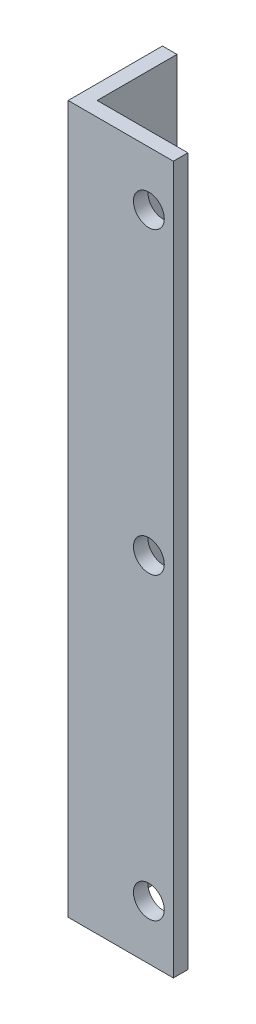
ISO-10303-21;
HEADER;
FILE_DESCRIPTION(('STEP AP214'),'2;1');
FILE_NAME('part.step','',(''),(''),'','','');
FILE_SCHEMA(('AUTOMOTIVE_DESIGN { 1 0 10303 214 1 1 1 1 }'));
ENDSEC;
DATA;
#1=APPLICATION_CONTEXT('core data for automotive mechanical design processes');
#2=APPLICATION_PROTOCOL_DEFINITION('international standard','automotive_design',2000,#1);
#3=PRODUCT_CONTEXT('',#1,'mechanical');
#4=PRODUCT('Part','Part','',(#3));
#5=PRODUCT_RELATED_PRODUCT_CATEGORY('part','',(#4));
#6=PRODUCT_DEFINITION_FORMATION('','',#4);
#7=PRODUCT_DEFINITION_CONTEXT('part definition',#1,'design');
#8=PRODUCT_DEFINITION('design','',#6,#7);
#9=PRODUCT_DEFINITION_SHAPE('','',#8);
#10=(LENGTH_UNIT() NAMED_UNIT(*) SI_UNIT(.MILLI.,.METRE.));
#11=(NAMED_UNIT(*) PLANE_ANGLE_UNIT() SI_UNIT($,.RADIAN.));
#12=(NAMED_UNIT(*) SI_UNIT($,.STERADIAN.) SOLID_ANGLE_UNIT());
#13=UNCERTAINTY_MEASURE_WITH_UNIT(LENGTH_MEASURE(1.E-05),#10,'distance_accuracy_value','');
#14=(GEOMETRIC_REPRESENTATION_CONTEXT(3) GLOBAL_UNCERTAINTY_ASSIGNED_CONTEXT((#13)) GLOBAL_UNIT_ASSIGNED_CONTEXT((#10,
#11,#12)) REPRESENTATION_CONTEXT('',''));
#15=CARTESIAN_POINT('',(0.,0.,0.));
#16=DIRECTION('',(0.,0.,1.));
#17=DIRECTION('',(1.,0.,0.));
#18=AXIS2_PLACEMENT_3D('',#15,#16,#17);
#19=CARTESIAN_POINT('',(25.,195.,0.));
#20=DIRECTION('',(-1.,0.,0.));
#21=DIRECTION('',(0.,0.,1.));
#22=AXIS2_PLACEMENT_3D('',#19,#20,#21);
#23=PLANE('',#22);
#24=DIRECTION('',(0.,0.,-1.));
#25=VECTOR('',#24,1.);
#26=CARTESIAN_POINT('',(25.,0.,0.));
#27=LINE('',#26,#25);
#28=CARTESIAN_POINT('',(25.,0.,4.));
#29=VERTEX_POINT('',#28);
#30=CARTESIAN_POINT('',(25.,0.,0.));
#31=VERTEX_POINT('',#30);
#32=EDGE_CURVE('E134',#29,#31,#27,.T.);
#33=ORIENTED_EDGE('',*,*,#32,.T.);
#34=DIRECTION('',(0.,-1.,0.));
#35=VECTOR('',#34,1.);
#36=CARTESIAN_POINT('',(25.,195.,0.));
#37=LINE('',#36,#35);
#38=CARTESIAN_POINT('',(25.,195.,0.));
#39=VERTEX_POINT('',#38);
#40=EDGE_CURVE('E11',#39,#31,#37,.T.);
#41=ORIENTED_EDGE('',*,*,#40,.F.);
#42=DIRECTION('',(0.,0.,-1.));
#43=VECTOR('',#42,1.);
#44=CARTESIAN_POINT('',(25.,195.,0.));
#45=LINE('',#44,#43);
#46=CARTESIAN_POINT('',(25.,195.,4.));
#47=VERTEX_POINT('',#46);
#48=EDGE_CURVE('E83',#47,#39,#45,.T.);
#49=ORIENTED_EDGE('',*,*,#48,.F.);
#50=DIRECTION('',(0.,1.,0.));
#51=VECTOR('',#50,1.);
#52=CARTESIAN_POINT('',(25.,195.,4.));
#53=LINE('',#52,#51);
#54=EDGE_CURVE('E87',#29,#47,#53,.T.);
#55=ORIENTED_EDGE('',*,*,#54,.F.);
#56=EDGE_LOOP('',(#33,#41,#49,#55));
#57=FACE_BOUND('',#56,.T.);
#58=ADVANCED_FACE('F34',(#57),#23,.F.);
#59=CARTESIAN_POINT('',(0.,195.,0.));
#60=DIRECTION('',(0.,0.,1.));
#61=DIRECTION('',(1.,0.,0.));
#62=AXIS2_PLACEMENT_3D('',#59,#60,#61);
#63=PLANE('',#62);
#64=CARTESIAN_POINT('',(18.25,180.,0.));
#65=DIRECTION('',(0.,0.,1.));
#66=DIRECTION('',(1.,0.,0.));
#67=AXIS2_PLACEMENT_3D('',#64,#65,#66);
#68=CIRCLE('',#67,4.25000000000001);
#69=CARTESIAN_POINT('',(22.5,180.,0.));
#70=VERTEX_POINT('',#69);
#71=EDGE_CURVE('E37',#70,#70,#68,.T.);
#72=ORIENTED_EDGE('',*,*,#71,.T.);
#73=EDGE_LOOP('',(#72));
#74=FACE_BOUND('',#73,.T.);
#75=CARTESIAN_POINT('',(18.25,97.5,0.));
#76=DIRECTION('',(0.,0.,1.));
#77=DIRECTION('',(1.,0.,0.));
#78=AXIS2_PLACEMENT_3D('',#75,#76,#77);
#79=CIRCLE('',#78,4.25);
#80=CARTESIAN_POINT('',(22.5,97.5,0.));
#81=VERTEX_POINT('',#80);
#82=EDGE_CURVE('E140',#81,#81,#79,.T.);
#83=ORIENTED_EDGE('',*,*,#82,.T.);
#84=EDGE_LOOP('',(#83));
#85=FACE_BOUND('',#84,.T.);
#86=CARTESIAN_POINT('',(18.25,15.,0.));
#87=DIRECTION('',(0.,0.,1.));
#88=DIRECTION('',(1.,0.,0.));
#89=AXIS2_PLACEMENT_3D('',#86,#87,#88);
#90=CIRCLE('',#89,4.25000000000001);
#91=CARTESIAN_POINT('',(22.5,15.,0.));
#92=VERTEX_POINT('',#91);
#93=EDGE_CURVE('E130',#92,#92,#90,.T.);
#94=ORIENTED_EDGE('',*,*,#93,.T.);
#95=EDGE_LOOP('',(#94));
#96=FACE_BOUND('',#95,.T.);
#97=DIRECTION('',(-1.,0.,0.));
#98=VECTOR('',#97,1.);
#99=CARTESIAN_POINT('',(0.,0.,0.));
#100=LINE('',#99,#98);
#101=CARTESIAN_POINT('',(0.,0.,0.));
#102=VERTEX_POINT('',#101);
#103=EDGE_CURVE('E88',#31,#102,#100,.T.);
#104=ORIENTED_EDGE('',*,*,#103,.T.);
#105=DIRECTION('',(0.,-1.,0.));
#106=VECTOR('',#105,1.);
#107=CARTESIAN_POINT('',(0.,195.,0.));
#108=LINE('',#107,#106);
#109=CARTESIAN_POINT('',(0.,195.,0.));
#110=VERTEX_POINT('',#109);
#111=EDGE_CURVE('E43',#110,#102,#108,.T.);
#112=ORIENTED_EDGE('',*,*,#111,.F.);
#113=DIRECTION('',(-1.,0.,0.));
#114=VECTOR('',#113,1.);
#115=CARTESIAN_POINT('',(0.,195.,0.));
#116=LINE('',#115,#114);
#117=EDGE_CURVE('E51',#39,#110,#116,.T.);
#118=ORIENTED_EDGE('',*,*,#117,.F.);
#119=ORIENTED_EDGE('',*,*,#40,.T.);
#120=EDGE_LOOP('',(#104,#112,#118,#119));
#121=FACE_BOUND('',#120,.T.);
#122=ADVANCED_FACE('F147',(#74,#85,#96,#121),#63,.F.);
#123=CARTESIAN_POINT('',(0.,195.,0.));
#124=DIRECTION('',(0.,-1.,0.));
#125=DIRECTION('',(0.,0.,-1.));
#126=AXIS2_PLACEMENT_3D('',#123,#124,#125);
#127=PLANE('',#126);
#128=ORIENTED_EDGE('',*,*,#117,.T.);
#129=DIRECTION('',(0.,0.,-1.));
#130=VECTOR('',#129,1.);
#131=CARTESIAN_POINT('',(0.,195.,3.));
#132=LINE('',#131,#130);
#133=CARTESIAN_POINT('',(0.,195.,-22.));
#134=VERTEX_POINT('',#133);
#135=EDGE_CURVE('E115',#110,#134,#132,.T.);
#136=ORIENTED_EDGE('',*,*,#135,.T.);
#137=DIRECTION('',(-1.,0.,0.));
#138=VECTOR('',#137,1.);
#139=CARTESIAN_POINT('',(0.,195.,-22.));
#140=LINE('',#139,#138);
#141=CARTESIAN_POINT('',(-4.,195.,-22.));
#142=VERTEX_POINT('',#141);
#143=EDGE_CURVE('E125',#134,#142,#140,.T.);
#144=ORIENTED_EDGE('',*,*,#143,.T.);
#145=DIRECTION('',(0.,0.,1.));
#146=VECTOR('',#145,1.);
#147=CARTESIAN_POINT('',(-4.,195.,3.));
#148=LINE('',#147,#146);
#149=CARTESIAN_POINT('',(-4.,195.,4.));
#150=VERTEX_POINT('',#149);
#151=EDGE_CURVE('E95',#142,#150,#148,.T.);
#152=ORIENTED_EDGE('',*,*,#151,.T.);
#153=DIRECTION('',(-1.,0.,0.));
#154=VECTOR('',#153,1.);
#155=CARTESIAN_POINT('',(25.,195.,4.));
#156=LINE('',#155,#154);
#157=EDGE_CURVE('E91',#47,#150,#156,.T.);
#158=ORIENTED_EDGE('',*,*,#157,.F.);
#159=ORIENTED_EDGE('',*,*,#48,.T.);
#160=EDGE_LOOP('',(#128,#136,#144,#152,#158,#159));
#161=FACE_BOUND('',#160,.T.);
#162=ADVANCED_FACE('F92',(#161),#127,.F.);
#163=CARTESIAN_POINT('',(0.,0.,0.));
#164=DIRECTION('',(0.,-1.,0.));
#165=DIRECTION('',(0.,0.,-1.));
#166=AXIS2_PLACEMENT_3D('',#163,#164,#165);
#167=PLANE('',#166);
#168=ORIENTED_EDGE('',*,*,#32,.F.);
#169=DIRECTION('',(1.,0.,0.));
#170=VECTOR('',#169,1.);
#171=CARTESIAN_POINT('',(25.,0.,4.));
#172=LINE('',#171,#170);
#173=CARTESIAN_POINT('',(-4.,0.,4.));
#174=VERTEX_POINT('',#173);
#175=EDGE_CURVE('E105',#174,#29,#172,.T.);
#176=ORIENTED_EDGE('',*,*,#175,.F.);
#177=DIRECTION('',(0.,0.,1.));
#178=VECTOR('',#177,1.);
#179=CARTESIAN_POINT('',(-4.,0.,3.));
#180=LINE('',#179,#178);
#181=CARTESIAN_POINT('',(-4.,0.,-22.));
#182=VERTEX_POINT('',#181);
#183=EDGE_CURVE('E121',#182,#174,#180,.T.);
#184=ORIENTED_EDGE('',*,*,#183,.F.);
#185=DIRECTION('',(-1.,0.,0.));
#186=VECTOR('',#185,1.);
#187=CARTESIAN_POINT('',(0.,0.,-22.));
#188=LINE('',#187,#186);
#189=CARTESIAN_POINT('',(0.,0.,-22.));
#190=VERTEX_POINT('',#189);
#191=EDGE_CURVE('E118',#190,#182,#188,.T.);
#192=ORIENTED_EDGE('',*,*,#191,.F.);
#193=DIRECTION('',(0.,0.,-1.));
#194=VECTOR('',#193,1.);
#195=CARTESIAN_POINT('',(0.,0.,3.));
#196=LINE('',#195,#194);
#197=EDGE_CURVE('E116',#102,#190,#196,.T.);
#198=ORIENTED_EDGE('',*,*,#197,.F.);
#199=ORIENTED_EDGE('',*,*,#103,.F.);
#200=EDGE_LOOP('',(#168,#176,#184,#192,#198,#199));
#201=FACE_BOUND('',#200,.T.);
#202=ADVANCED_FACE('F181',(#201),#167,.T.);
#203=CARTESIAN_POINT('',(18.25,15.,-192.));
#204=DIRECTION('',(0.,0.,1.));
#205=DIRECTION('',(1.,0.,0.));
#206=AXIS2_PLACEMENT_3D('',#203,#204,#205);
#207=CYLINDRICAL_SURFACE('',#206,4.25000000000001);
#208=ORIENTED_EDGE('',*,*,#93,.F.);
#209=EDGE_LOOP('',(#208));
#210=FACE_BOUND('',#209,.T.);
#211=CARTESIAN_POINT('',(18.25,15.,4.));
#212=DIRECTION('',(0.,0.,1.));
#213=DIRECTION('',(1.,0.,0.));
#214=AXIS2_PLACEMENT_3D('',#211,#212,#213);
#215=CIRCLE('',#214,4.25);
#216=CARTESIAN_POINT('',(22.5,15.,4.));
#217=VERTEX_POINT('',#216);
#218=EDGE_CURVE('E106',#217,#217,#215,.T.);
#219=ORIENTED_EDGE('',*,*,#218,.T.);
#220=EDGE_LOOP('',(#219));
#221=FACE_BOUND('',#220,.T.);
#222=ADVANCED_FACE('F185',(#210,#221),#207,.F.);
#223=CARTESIAN_POINT('',(18.25,97.5,-192.));
#224=DIRECTION('',(0.,0.,1.));
#225=DIRECTION('',(1.,0.,0.));
#226=AXIS2_PLACEMENT_3D('',#223,#224,#225);
#227=CYLINDRICAL_SURFACE('',#226,4.25);
#228=ORIENTED_EDGE('',*,*,#82,.F.);
#229=EDGE_LOOP('',(#228));
#230=FACE_BOUND('',#229,.T.);
#231=CARTESIAN_POINT('',(18.25,97.5,4.));
#232=DIRECTION('',(0.,0.,1.));
#233=DIRECTION('',(1.,0.,0.));
#234=AXIS2_PLACEMENT_3D('',#231,#232,#233);
#235=CIRCLE('',#234,4.25000000000001);
#236=CARTESIAN_POINT('',(22.5,97.5,4.));
#237=VERTEX_POINT('',#236);
#238=EDGE_CURVE('E109',#237,#237,#235,.T.);
#239=ORIENTED_EDGE('',*,*,#238,.T.);
#240=EDGE_LOOP('',(#239));
#241=FACE_BOUND('',#240,.T.);
#242=ADVANCED_FACE('F153',(#230,#241),#227,.F.);
#243=CARTESIAN_POINT('',(18.25,180.,-192.));
#244=DIRECTION('',(0.,0.,1.));
#245=DIRECTION('',(1.,0.,0.));
#246=AXIS2_PLACEMENT_3D('',#243,#244,#245);
#247=CYLINDRICAL_SURFACE('',#246,4.25000000000001);
#248=ORIENTED_EDGE('',*,*,#71,.F.);
#249=EDGE_LOOP('',(#248));
#250=FACE_BOUND('',#249,.T.);
#251=CARTESIAN_POINT('',(18.25,180.,4.));
#252=DIRECTION('',(0.,0.,1.));
#253=DIRECTION('',(1.,0.,0.));
#254=AXIS2_PLACEMENT_3D('',#251,#252,#253);
#255=CIRCLE('',#254,4.24999999999999);
#256=CARTESIAN_POINT('',(22.5,180.,4.));
#257=VERTEX_POINT('',#256);
#258=EDGE_CURVE('E157',#257,#257,#255,.T.);
#259=ORIENTED_EDGE('',*,*,#258,.T.);
#260=EDGE_LOOP('',(#259));
#261=FACE_BOUND('',#260,.T.);
#262=ADVANCED_FACE('F149',(#250,#261),#247,.F.);
#263=CARTESIAN_POINT('',(0.,0.,3.));
#264=DIRECTION('',(1.,0.,0.));
#265=DIRECTION('',(0.,0.,-1.));
#266=AXIS2_PLACEMENT_3D('',#263,#264,#265);
#267=PLANE('',#266);
#268=ORIENTED_EDGE('',*,*,#135,.F.);
#269=ORIENTED_EDGE('',*,*,#111,.T.);
#270=ORIENTED_EDGE('',*,*,#197,.T.);
#271=DIRECTION('',(0.,1.,0.));
#272=VECTOR('',#271,1.);
#273=CARTESIAN_POINT('',(0.,0.,-22.));
#274=LINE('',#273,#272);
#275=EDGE_CURVE('E123',#190,#134,#274,.T.);
#276=ORIENTED_EDGE('',*,*,#275,.T.);
#277=EDGE_LOOP('',(#268,#269,#270,#276));
#278=FACE_BOUND('',#277,.T.);
#279=ADVANCED_FACE('F152',(#278),#267,.T.);
#280=CARTESIAN_POINT('',(-4.,0.,3.));
#281=DIRECTION('',(-1.,0.,0.));
#282=DIRECTION('',(0.,0.,1.));
#283=AXIS2_PLACEMENT_3D('',#280,#281,#282);
#284=PLANE('',#283);
#285=ORIENTED_EDGE('',*,*,#151,.F.);
#286=DIRECTION('',(0.,1.,0.));
#287=VECTOR('',#286,1.);
#288=CARTESIAN_POINT('',(-4.,0.,-22.));
#289=LINE('',#288,#287);
#290=EDGE_CURVE('E128',#182,#142,#289,.T.);
#291=ORIENTED_EDGE('',*,*,#290,.F.);
#292=ORIENTED_EDGE('',*,*,#183,.T.);
#293=DIRECTION('',(0.,-1.,0.));
#294=VECTOR('',#293,1.);
#295=CARTESIAN_POINT('',(-4.,195.,4.));
#296=LINE('',#295,#294);
#297=EDGE_CURVE('E99',#150,#174,#296,.T.);
#298=ORIENTED_EDGE('',*,*,#297,.F.);
#299=EDGE_LOOP('',(#285,#291,#292,#298));
#300=FACE_BOUND('',#299,.T.);
#301=ADVANCED_FACE('F170',(#300),#284,.T.);
#302=CARTESIAN_POINT('',(0.,0.,-22.));
#303=DIRECTION('',(0.,0.,-1.));
#304=DIRECTION('',(-1.,0.,0.));
#305=AXIS2_PLACEMENT_3D('',#302,#303,#304);
#306=PLANE('',#305);
#307=ORIENTED_EDGE('',*,*,#143,.F.);
#308=ORIENTED_EDGE('',*,*,#275,.F.);
#309=ORIENTED_EDGE('',*,*,#191,.T.);
#310=ORIENTED_EDGE('',*,*,#290,.T.);
#311=EDGE_LOOP('',(#307,#308,#309,#310));
#312=FACE_BOUND('',#311,.T.);
#313=ADVANCED_FACE('F165',(#312),#306,.T.);
#314=CARTESIAN_POINT('',(0.,0.,4.));
#315=DIRECTION('',(0.,0.,-1.));
#316=DIRECTION('',(-1.,0.,0.));
#317=AXIS2_PLACEMENT_3D('',#314,#315,#316);
#318=PLANE('',#317);
#319=ORIENTED_EDGE('',*,*,#54,.T.);
#320=ORIENTED_EDGE('',*,*,#157,.T.);
#321=ORIENTED_EDGE('',*,*,#297,.T.);
#322=ORIENTED_EDGE('',*,*,#175,.T.);
#323=EDGE_LOOP('',(#319,#320,#321,#322));
#324=FACE_BOUND('',#323,.T.);
#325=ORIENTED_EDGE('',*,*,#218,.F.);
#326=EDGE_LOOP('',(#325));
#327=FACE_BOUND('',#326,.T.);
#328=ORIENTED_EDGE('',*,*,#238,.F.);
#329=EDGE_LOOP('',(#328));
#330=FACE_BOUND('',#329,.T.);
#331=ORIENTED_EDGE('',*,*,#258,.F.);
#332=EDGE_LOOP('',(#331));
#333=FACE_BOUND('',#332,.T.);
#334=ADVANCED_FACE('F102',(#324,#327,#330,#333),#318,.F.);
#335=CLOSED_SHELL('',(#58,#122,#162,#202,#222,#242,#262,#279,#301,#313,#334));
#336=MANIFOLD_SOLID_BREP('B2',#335);
#337=ADVANCED_BREP_SHAPE_REPRESENTATION('',(#18,#336),#14);
#338=SHAPE_DEFINITION_REPRESENTATION(#9,#337);
ENDSEC;
END-ISO-10303-21;
